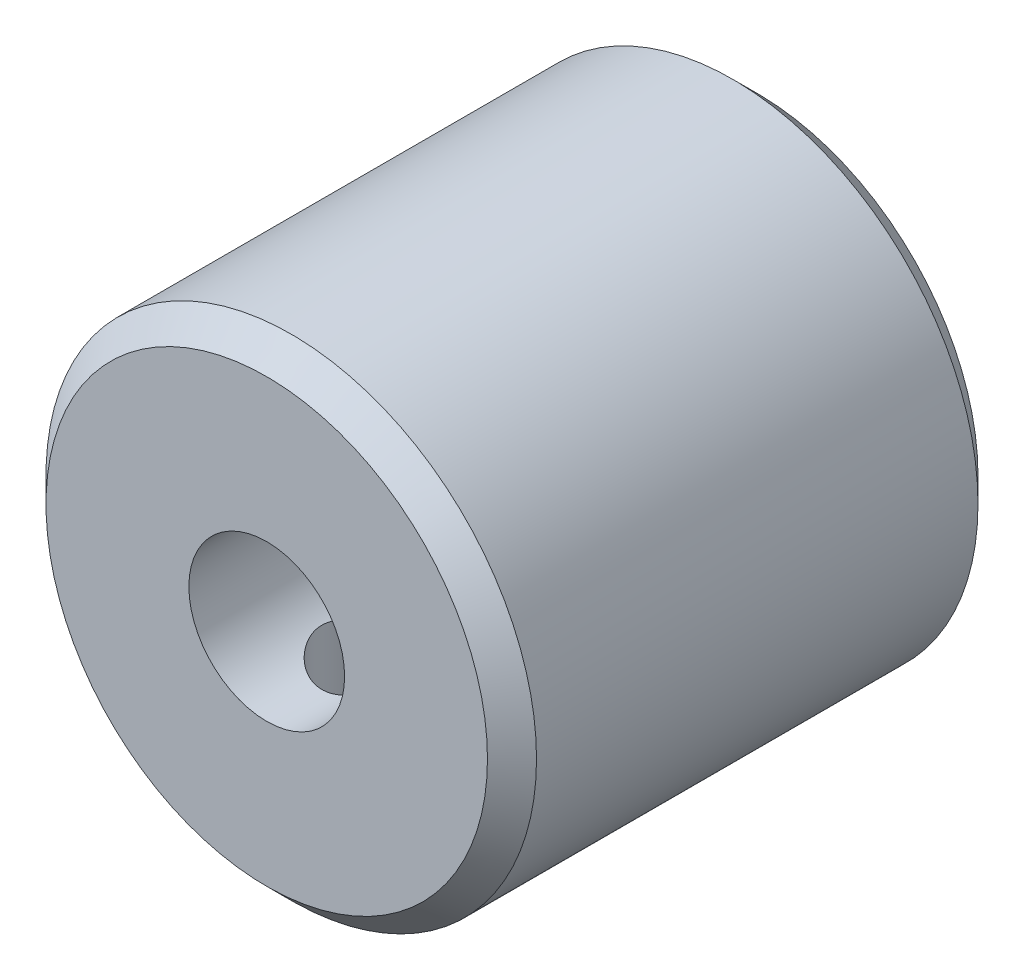
ISO-10303-21;
HEADER;
FILE_DESCRIPTION(('STEP AP214'),'2;1');
FILE_NAME('part.step','',(''),(''),'','','');
FILE_SCHEMA(('AUTOMOTIVE_DESIGN { 1 0 10303 214 1 1 1 1 }'));
ENDSEC;
DATA;
#1=APPLICATION_CONTEXT('core data for automotive mechanical design processes');
#2=APPLICATION_PROTOCOL_DEFINITION('international standard','automotive_design',2000,#1);
#3=PRODUCT_CONTEXT('',#1,'mechanical');
#4=PRODUCT('Part','Part','',(#3));
#5=PRODUCT_RELATED_PRODUCT_CATEGORY('part','',(#4));
#6=PRODUCT_DEFINITION_FORMATION('','',#4);
#7=PRODUCT_DEFINITION_CONTEXT('part definition',#1,'design');
#8=PRODUCT_DEFINITION('design','',#6,#7);
#9=PRODUCT_DEFINITION_SHAPE('','',#8);
#10=(LENGTH_UNIT() NAMED_UNIT(*) SI_UNIT(.MILLI.,.METRE.));
#11=(NAMED_UNIT(*) PLANE_ANGLE_UNIT() SI_UNIT($,.RADIAN.));
#12=(NAMED_UNIT(*) SI_UNIT($,.STERADIAN.) SOLID_ANGLE_UNIT());
#13=UNCERTAINTY_MEASURE_WITH_UNIT(LENGTH_MEASURE(1.E-05),#10,'distance_accuracy_value','');
#14=(GEOMETRIC_REPRESENTATION_CONTEXT(3) GLOBAL_UNCERTAINTY_ASSIGNED_CONTEXT((#13)) GLOBAL_UNIT_ASSIGNED_CONTEXT((#10,
#11,#12)) REPRESENTATION_CONTEXT('',''));
#15=CARTESIAN_POINT('',(0.,0.,0.));
#16=DIRECTION('',(0.,0.,1.));
#17=DIRECTION('',(1.,0.,0.));
#18=AXIS2_PLACEMENT_3D('',#15,#16,#17);
#19=CARTESIAN_POINT('',(0.,0.,5.));
#20=DIRECTION('',(0.,0.,-1.));
#21=DIRECTION('',(-1.,0.,0.));
#22=AXIS2_PLACEMENT_3D('',#19,#20,#21);
#23=CYLINDRICAL_SURFACE('',#22,1.5875);
#24=CARTESIAN_POINT('',(0.,-1.5875,2.125));
#25=CARTESIAN_POINT('',(-0.0454171672703915,-1.58749743073269,2.12500284288988));
#26=CARTESIAN_POINT('',(-0.0908705645486175,-1.58553118946856,2.12855649012872));
#27=CARTESIAN_POINT('',(-0.180397474742064,-1.57785918643117,2.14259601348306));
#28=CARTESIAN_POINT('',(-0.224469037782208,-1.57214836947093,2.15309126094395));
#29=CARTESIAN_POINT('',(-0.309808743333079,-1.55757562422254,2.18046123539258));
#30=CARTESIAN_POINT('',(-0.351087633505968,-1.5487267042626,2.19730964470073));
#31=CARTESIAN_POINT('',(-0.430149329626289,-1.5286575434006,2.23675012411678));
#32=CARTESIAN_POINT('',(-0.467931977044709,-1.51743719504729,2.25934245449556));
#33=CARTESIAN_POINT('',(-0.54185906580046,-1.49270462707936,2.31138108884109));
#34=CARTESIAN_POINT('',(-0.577710731935367,-1.47908770407883,2.34119267625411));
#35=CARTESIAN_POINT('',(-0.64418267175549,-1.45137326900455,2.40601982591914));
#36=CARTESIAN_POINT('',(-0.674798032873614,-1.43727532035425,2.44104021798518));
#37=CARTESIAN_POINT('',(-0.732992485731451,-1.40855673758792,2.51941807126515));
#38=CARTESIAN_POINT('',(-0.759970470973205,-1.39402264499961,2.56325773747891));
#39=CARTESIAN_POINT('',(-0.806067190483714,-1.36788811317943,2.65570061755626));
#40=CARTESIAN_POINT('',(-0.825192141404631,-1.35628535624174,2.70430002559675));
#41=CARTESIAN_POINT('',(-0.853679413441935,-1.33852742371106,2.8018359305105));
#42=CARTESIAN_POINT('',(-0.863582253594607,-1.3320743536933,2.85055708463884));
#43=CARTESIAN_POINT('',(-0.874941794813468,-1.32464526189731,2.94935754242108));
#44=CARTESIAN_POINT('',(-0.876410716322343,-1.32366131562288,2.99943477532631));
#45=CARTESIAN_POINT('',(-0.871254765726646,-1.32705423910451,3.09123604953529));
#46=CARTESIAN_POINT('',(-0.865834198499974,-1.33063371187153,3.13306556067878));
#47=CARTESIAN_POINT('',(-0.849184818616249,-1.34131965108467,3.21508637655361));
#48=CARTESIAN_POINT('',(-0.837953336505919,-1.3484277384663,3.25527691920346));
#49=CARTESIAN_POINT('',(-0.809855349167469,-1.36549037960906,3.33398313485091));
#50=CARTESIAN_POINT('',(-0.792872989921156,-1.37550279380309,3.37244429087748));
#51=CARTESIAN_POINT('',(-0.753855973097453,-1.39726739410924,3.4461700972764));
#52=CARTESIAN_POINT('',(-0.731819140109118,-1.40902032855538,3.48143336215308));
#53=CARTESIAN_POINT('',(-0.679262218129388,-1.43518298795478,3.55364748201827));
#54=CARTESIAN_POINT('',(-0.647951034206348,-1.44971847274687,3.58997920601274));
#55=CARTESIAN_POINT('',(-0.57970126454564,-1.47833460694525,3.65716546685922));
#56=CARTESIAN_POINT('',(-0.542758830744465,-1.49241493729002,3.68801622688717));
#57=CARTESIAN_POINT('',(-0.461184255174894,-1.5196824748554,3.74537436896565));
#58=CARTESIAN_POINT('',(-0.416201036542465,-1.53274488985838,3.77144693475787));
#59=CARTESIAN_POINT('',(-0.321593896994065,-1.55534248764104,3.8154237746184));
#60=CARTESIAN_POINT('',(-0.271974408026113,-1.56488099666917,3.83333575528515));
#61=CARTESIAN_POINT('',(-0.174454043982302,-1.57858041330335,3.85877118487706));
#62=CARTESIAN_POINT('',(-0.126825208538458,-1.58316023600003,3.8671083861097));
#63=CARTESIAN_POINT('',(-0.0306371038385625,-1.5879327344506,3.87579311005673));
#64=CARTESIAN_POINT('',(0.017921546474652,-1.58812823358383,3.87614577458645));
#65=CARTESIAN_POINT('',(0.109486774797948,-1.58431772411544,3.86921632551847));
#66=CARTESIAN_POINT('',(0.152570140497963,-1.5807225886303,3.86268085578954));
#67=CARTESIAN_POINT('',(0.236916324634259,-1.57029713420082,3.84342590921152));
#68=CARTESIAN_POINT('',(0.278178958838685,-1.56346648868624,3.83070580812461));
#69=CARTESIAN_POINT('',(0.358816906525529,-1.54697755791703,3.79924426395291));
#70=CARTESIAN_POINT('',(0.398129714048013,-1.53725968134985,3.7803750180397));
#71=CARTESIAN_POINT('',(0.473132853294014,-1.51585783039415,3.73732111104386));
#72=CARTESIAN_POINT('',(0.508821861005728,-1.50417314151457,3.71313451732811));
#73=CARTESIAN_POINT('',(0.579832517608267,-1.47835474893972,3.65703146092703));
#74=CARTESIAN_POINT('',(0.614663386689606,-1.46409336823534,3.62455211146354));
#75=CARTESIAN_POINT('',(0.678648445504201,-1.43555652687459,3.55436455655753));
#76=CARTESIAN_POINT('',(0.70779667147375,-1.42128106706096,3.5166509281759));
#77=CARTESIAN_POINT('',(0.761834431307986,-1.39311312913222,3.43345342164588));
#78=CARTESIAN_POINT('',(0.786210517822469,-1.37933854188116,3.38759208000716));
#79=CARTESIAN_POINT('',(0.826667739297664,-1.35548297144746,3.29146885438906));
#80=CARTESIAN_POINT('',(0.842760965431796,-1.34539661052494,3.24121351088275));
#81=CARTESIAN_POINT('',(0.864585341315519,-1.33146623546188,3.14283750191008));
#82=CARTESIAN_POINT('',(0.871168938844523,-1.32711235764623,3.09498130989524));
#83=CARTESIAN_POINT('',(0.876323519136846,-1.32371677747805,2.9986675986912));
#84=CARTESIAN_POINT('',(0.874901493422308,-1.32467043990219,2.95021064106392));
#85=CARTESIAN_POINT('',(0.864916166051227,-1.331202719063,2.86117281001033));
#86=CARTESIAN_POINT('',(0.857359153657994,-1.33612901032972,2.82042329549937));
#87=CARTESIAN_POINT('',(0.83675736948217,-1.34912595061852,2.74086357887791));
#88=CARTESIAN_POINT('',(0.823710325134274,-1.35719790166497,2.70205418732108));
#89=CARTESIAN_POINT('',(0.791650172225481,-1.37615835705143,2.62480633283136));
#90=CARTESIAN_POINT('',(0.772321799905801,-1.3871885859529,2.58653476847737));
#91=CARTESIAN_POINT('',(0.728545161387628,-1.41067191172468,2.51352169633025));
#92=CARTESIAN_POINT('',(0.704094183454616,-1.42312576061842,2.47878207275243));
#93=CARTESIAN_POINT('',(0.64627549817979,-1.45039961574333,2.40809343117753));
#94=CARTESIAN_POINT('',(0.612109646378666,-1.46528297562292,2.37281808439262));
#95=CARTESIAN_POINT('',(0.538093774881354,-1.4940509185377,2.30826869263461));
#96=CARTESIAN_POINT('',(0.498239678492876,-1.50793477441159,2.278998988822));
#97=CARTESIAN_POINT('',(0.41207674031173,-1.53376728428567,2.22640171104107));
#98=CARTESIAN_POINT('',(0.365588650470946,-1.54562947463329,2.20332270248029));
#99=CARTESIAN_POINT('',(0.26857768740612,-1.56539256755205,2.1656245313491));
#100=CARTESIAN_POINT('',(0.218065508981272,-1.57330358903599,2.15098374358358));
#101=CARTESIAN_POINT('',(0.139136449938288,-1.58163165250096,2.1356826922273));
#102=CARTESIAN_POINT('',(0.111512220231608,-1.58382335938445,2.13168557509789));
#103=CARTESIAN_POINT('',(0.0559299041083315,-1.58675831202277,2.12634337605553));
#104=CARTESIAN_POINT('',(0.0279718233698305,-1.58750158237723,2.1249982491023));
#105=CARTESIAN_POINT('',(0.,-1.5875,2.125));
#106=B_SPLINE_CURVE_WITH_KNOTS('',3,(#24,#25,#26,#27,#28,#29,#30,#31,#32,#33,#34,#35,#36,#37,
#38,#39,#40,#41,#42,#43,#44,#45,#46,#47,#48,#49,#50,#51,#52,#53,#54,#55,#56,#57,#58,#59,#60,#61,
#62,#63,#64,#65,#66,#67,#68,#69,#70,#71,#72,#73,#74,#75,#76,#77,#78,#79,#80,#81,#82,#83,#84,#85,
#86,#87,#88,#89,#90,#91,#92,#93,#94,#95,#96,#97,#98,#99,#100,#101,#102,#103,#104,#105),
.UNSPECIFIED.,.T.,.F.,(4,2,2,2,2,2,2,2,2,2,2,2,2,2,2,2,2,2,2,2,2,2,2,2,2,2,2,2,2,2,2,2,2,2,2,2,
2,2,2,2,4),(0.,0.136138910180349,0.272461987693227,0.408226448668004,0.54399706255384,
0.689132991238192,0.834404344603793,0.994064820621523,1.15359866073264,1.30305190647804,
1.45228854512576,1.57868533175798,1.70514023493623,1.83431128683925,1.96353803774841,
2.1132570493831,2.26307883262492,2.42303249795653,2.58283479339052,2.7277179144785,
2.87250773228733,3.00307326700455,3.13365198292278,3.26713907256983,3.40067475962752,
3.54919759723243,3.69787547581227,3.85821651177356,4.01832281607177,4.16292649542564,
4.30740390817,4.43206404168932,4.55677582835407,4.68909166707472,4.82147772712209,
4.97474708366707,5.1281268431894,5.28696559077414,5.4453954405586,5.52924299103784,
5.61308911747401),.UNSPECIFIED.);
#107=CARTESIAN_POINT('',(0.,-1.5875,2.125));
#108=VERTEX_POINT('',#107);
#109=EDGE_CURVE('E213',#108,#108,#106,.T.);
#110=ORIENTED_EDGE('',*,*,#109,.F.);
#111=EDGE_LOOP('',(#110));
#112=FACE_BOUND('',#111,.T.);
#113=CARTESIAN_POINT('',(0.,0.,5.));
#114=DIRECTION('',(0.,0.,1.));
#115=DIRECTION('',(1.,0.,0.));
#116=AXIS2_PLACEMENT_3D('',#113,#114,#115);
#117=CIRCLE('',#116,1.5875);
#118=CARTESIAN_POINT('',(1.5875,0.,5.));
#119=VERTEX_POINT('',#118);
#120=EDGE_CURVE('E70',#119,#119,#117,.T.);
#121=ORIENTED_EDGE('',*,*,#120,.T.);
#122=EDGE_LOOP('',(#121));
#123=FACE_BOUND('',#122,.T.);
#124=CARTESIAN_POINT('',(0.,0.,0.));
#125=DIRECTION('',(0.,0.,-1.));
#126=DIRECTION('',(-1.,0.,0.));
#127=AXIS2_PLACEMENT_3D('',#124,#125,#126);
#128=CIRCLE('',#127,1.5875);
#129=CARTESIAN_POINT('',(-1.5875,0.,0.));
#130=VERTEX_POINT('',#129);
#131=EDGE_CURVE('E71',#130,#130,#128,.T.);
#132=ORIENTED_EDGE('',*,*,#131,.T.);
#133=EDGE_LOOP('',(#132));
#134=FACE_BOUND('',#133,.T.);
#135=ADVANCED_FACE('F45',(#112,#123,#134),#23,.F.);
#136=CARTESIAN_POINT('',(0.,0.,5.));
#137=DIRECTION('',(0.,0.,1.));
#138=DIRECTION('',(1.,0.,0.));
#139=AXIS2_PLACEMENT_3D('',#136,#137,#138);
#140=PLANE('',#139);
#141=CARTESIAN_POINT('',(0.,0.,5.));
#142=DIRECTION('',(0.,0.,1.));
#143=DIRECTION('',(1.,0.,0.));
#144=AXIS2_PLACEMENT_3D('',#141,#142,#143);
#145=CIRCLE('',#144,4.5);
#146=CARTESIAN_POINT('',(4.5,0.,5.));
#147=VERTEX_POINT('',#146);
#148=EDGE_CURVE('E10',#147,#147,#145,.T.);
#149=ORIENTED_EDGE('',*,*,#148,.T.);
#150=EDGE_LOOP('',(#149));
#151=FACE_BOUND('',#150,.T.);
#152=ORIENTED_EDGE('',*,*,#120,.F.);
#153=EDGE_LOOP('',(#152));
#154=FACE_BOUND('',#153,.T.);
#155=ADVANCED_FACE('F126',(#151,#154),#140,.T.);
#156=CARTESIAN_POINT('',(0.,0.,-5.));
#157=DIRECTION('',(0.,0.,1.));
#158=DIRECTION('',(1.,0.,0.));
#159=AXIS2_PLACEMENT_3D('',#156,#157,#158);
#160=PLANE('',#159);
#161=CARTESIAN_POINT('',(0.,0.,-5.));
#162=DIRECTION('',(0.,0.,1.));
#163=DIRECTION('',(1.,0.,0.));
#164=AXIS2_PLACEMENT_3D('',#161,#162,#163);
#165=CIRCLE('',#164,4.5);
#166=CARTESIAN_POINT('',(4.5,0.,-5.));
#167=VERTEX_POINT('',#166);
#168=EDGE_CURVE('E54',#167,#167,#165,.F.);
#169=ORIENTED_EDGE('',*,*,#168,.T.);
#170=EDGE_LOOP('',(#169));
#171=FACE_BOUND('',#170,.T.);
#172=CARTESIAN_POINT('',(0.,0.,-5.));
#173=DIRECTION('',(0.,0.,-1.));
#174=DIRECTION('',(-1.,0.,0.));
#175=AXIS2_PLACEMENT_3D('',#172,#173,#174);
#176=CIRCLE('',#175,3.1);
#177=CARTESIAN_POINT('',(-3.1,0.,-5.));
#178=VERTEX_POINT('',#177);
#179=EDGE_CURVE('E79',#178,#178,#176,.T.);
#180=ORIENTED_EDGE('',*,*,#179,.F.);
#181=EDGE_LOOP('',(#180));
#182=FACE_BOUND('',#181,.T.);
#183=ADVANCED_FACE('F129',(#171,#182),#160,.F.);
#184=CARTESIAN_POINT('',(0.,0.,5.));
#185=DIRECTION('',(0.,0.,-1.));
#186=DIRECTION('',(-1.,0.,0.));
#187=AXIS2_PLACEMENT_3D('',#184,#185,#186);
#188=CYLINDRICAL_SURFACE('',#187,5.);
#189=CARTESIAN_POINT('',(0.,-5.,2.125));
#190=CARTESIAN_POINT('',(-0.0487501094989268,-4.99999914275497,2.12500192117746));
#191=CARTESIAN_POINT('',(-0.0975259127429578,-4.99927962652907,2.12908789063088));
#192=CARTESIAN_POINT('',(-0.193707009431263,-4.99647864363298,2.14531557747874));
#193=CARTESIAN_POINT('',(-0.241111043359642,-4.99439596434472,2.15746446747556));
#194=CARTESIAN_POINT('',(-0.333143358053326,-4.9891020139581,2.18943786899752));
#195=CARTESIAN_POINT('',(-0.377773963819231,-4.98589170360864,2.20925584786707));
#196=CARTESIAN_POINT('',(-0.463071487684834,-4.97869453598125,2.25598719203051));
#197=CARTESIAN_POINT('',(-0.503738806960561,-4.97470775742257,2.28289983815651));
#198=CARTESIAN_POINT('',(-0.580387290324578,-4.96635208436405,2.34335680488982));
#199=CARTESIAN_POINT('',(-0.616320824905511,-4.96197995101908,2.37696106982108));
#200=CARTESIAN_POINT('',(-0.682070048249341,-4.95337083160601,2.44971836846761));
#201=CARTESIAN_POINT('',(-0.711885330946749,-4.94913385452393,2.48887177018508));
#202=CARTESIAN_POINT('',(-0.764745399597419,-4.94124337561985,2.57194678136325));
#203=CARTESIAN_POINT('',(-0.78774256012236,-4.93759405587701,2.6158991265517));
#204=CARTESIAN_POINT('',(-0.826008900852615,-4.93133730599557,2.7071176962039));
#205=CARTESIAN_POINT('',(-0.841278658327646,-4.92872979803227,2.75438367282492));
#206=CARTESIAN_POINT('',(-0.863505580295149,-4.92488429460338,2.85038101572072));
#207=CARTESIAN_POINT('',(-0.870545305999552,-4.92363270645214,2.89909271104713));
#208=CARTESIAN_POINT('',(-0.876368425046627,-4.92259969093138,2.99702073380921));
#209=CARTESIAN_POINT('',(-0.875152462644541,-4.92281814884277,3.04623702156835));
#210=CARTESIAN_POINT('',(-0.864565853569317,-4.92468814513331,3.14318442521639));
#211=CARTESIAN_POINT('',(-0.855288388211477,-4.92632330747898,3.19092607857035));
#212=CARTESIAN_POINT('',(-0.828988558074648,-4.93081680373849,3.28416461617108));
#213=CARTESIAN_POINT('',(-0.811965902962413,-4.93367518350516,3.32966141619726));
#214=CARTESIAN_POINT('',(-0.770565730550925,-4.94031051718111,3.41739527225432));
#215=CARTESIAN_POINT('',(-0.746149933714665,-4.9440922316226,3.45961388993045));
#216=CARTESIAN_POINT('',(-0.690683688967044,-4.95214488870596,3.53939018454047));
#217=CARTESIAN_POINT('',(-0.659632652087572,-4.95641587476174,3.57694744724737));
#218=CARTESIAN_POINT('',(-0.59127170188294,-4.96503756922751,3.64687391724938));
#219=CARTESIAN_POINT('',(-0.553881934056068,-4.96938856865413,3.6791650727837));
#220=CARTESIAN_POINT('',(-0.474173840588685,-4.97762612546346,3.7370274721127));
#221=CARTESIAN_POINT('',(-0.431855476858921,-4.98151267925636,3.76259866396908));
#222=CARTESIAN_POINT('',(-0.343414968258774,-4.98838981445336,3.80630405407797));
#223=CARTESIAN_POINT('',(-0.297289109487091,-4.99137950755354,3.824430885508));
#224=CARTESIAN_POINT('',(-0.202583498061396,-4.99611904699053,3.85265807346813));
#225=CARTESIAN_POINT('',(-0.154003972458799,-4.99786900782229,3.86275917122197));
#226=CARTESIAN_POINT('',(-0.0564422773455108,-4.99991638609343,3.87454125761278));
#227=CARTESIAN_POINT('',(-0.0074734123891832,-5.00023227249724,3.87632931440065));
#228=CARTESIAN_POINT('',(0.0900639248266533,-4.99942666204999,3.87172068696385));
#229=CARTESIAN_POINT('',(0.138632414041912,-4.99830522638694,3.86532435115569));
#230=CARTESIAN_POINT('',(0.233656166890118,-4.99476243536818,3.84461755286773));
#231=CARTESIAN_POINT('',(0.280123435956158,-4.99234986416349,3.83036055029467));
#232=CARTESIAN_POINT('',(0.370008247372695,-4.98649419689881,3.79439444489028));
#233=CARTESIAN_POINT('',(0.413425603991588,-4.98305103814581,3.77268488869125));
#234=CARTESIAN_POINT('',(0.496440071029972,-4.97547017014808,3.72218790596204));
#235=CARTESIAN_POINT('',(0.535996245786059,-4.97132607546551,3.69333416081651));
#236=CARTESIAN_POINT('',(0.60974350508432,-4.96282111614282,3.62945849993344));
#237=CARTESIAN_POINT('',(0.643934156866018,-4.95846023405486,3.59443608714016));
#238=CARTESIAN_POINT('',(0.706380574970102,-4.949952873694,3.51873525246942));
#239=CARTESIAN_POINT('',(0.734563712125386,-4.94580943106317,3.4779965219531));
#240=CARTESIAN_POINT('',(0.783686536205751,-4.93826443479044,3.39230008464813));
#241=CARTESIAN_POINT('',(0.804626469135323,-4.93486285595371,3.34734252121172));
#242=CARTESIAN_POINT('',(0.838562018663509,-4.92920991248829,3.2546804386031));
#243=CARTESIAN_POINT('',(0.851592677626465,-4.92695348163441,3.20698907618682));
#244=CARTESIAN_POINT('',(0.869449267335573,-4.92383403155312,3.1100513372954));
#245=CARTESIAN_POINT('',(0.874275992307767,-4.92297087744246,3.06080511181738));
#246=CARTESIAN_POINT('',(0.875563826482354,-4.92274192651214,2.96288164693503));
#247=CARTESIAN_POINT('',(0.872139343490512,-4.92335565174978,2.91420592261074));
#248=CARTESIAN_POINT('',(0.85727055160933,-4.92596622439218,2.81813493831118));
#249=CARTESIAN_POINT('',(0.8458262766949,-4.92796306593754,2.77073967291227));
#250=CARTESIAN_POINT('',(0.81528833797368,-4.9331067666413,2.6786259286533));
#251=CARTESIAN_POINT('',(0.796205510132455,-4.93625199615651,2.63390376062232));
#252=CARTESIAN_POINT('',(0.750944178717729,-4.94333948543074,2.54827728610193));
#253=CARTESIAN_POINT('',(0.724765264633723,-4.94728179129748,2.50737320067372));
#254=CARTESIAN_POINT('',(0.665650633739469,-4.95558363821485,2.42996785637861));
#255=CARTESIAN_POINT('',(0.632631087648904,-4.95994795856167,2.39353112077113));
#256=CARTESIAN_POINT('',(0.560948607936387,-4.96856489629516,2.32667689990941));
#257=CARTESIAN_POINT('',(0.522284376947037,-4.97281748773634,2.29626080222751));
#258=CARTESIAN_POINT('',(0.440055093696432,-4.98076994692184,2.24209529667808));
#259=CARTESIAN_POINT('',(0.396454612747407,-4.98446530874485,2.21839900044762));
#260=CARTESIAN_POINT('',(0.305843313146272,-4.99084308949771,2.17870436206513));
#261=CARTESIAN_POINT('',(0.25883586852507,-4.99352649469304,2.16269852050771));
#262=CARTESIAN_POINT('',(0.176385235003814,-4.99700720137926,2.14222720968014));
#263=CARTESIAN_POINT('',(0.141434689052827,-4.99812337235796,2.13577761652577));
#264=CARTESIAN_POINT('',(0.0709939640711841,-4.99962007640936,2.12716335530781));
#265=CARTESIAN_POINT('',(0.0355037959363215,-5.00000062431558,2.12499860084227));
#266=CARTESIAN_POINT('',(0.,-5.,2.125));
#267=B_SPLINE_CURVE_WITH_KNOTS('',3,(#189,#190,#191,#192,#193,#194,#195,#196,#197,#198,#199,
#200,#201,#202,#203,#204,#205,#206,#207,#208,#209,#210,#211,#212,#213,#214,#215,#216,#217,#218,
#219,#220,#221,#222,#223,#224,#225,#226,#227,#228,#229,#230,#231,#232,#233,#234,#235,#236,#237,
#238,#239,#240,#241,#242,#243,#244,#245,#246,#247,#248,#249,#250,#251,#252,#253,#254,#255,#256,
#257,#258,#259,#260,#261,#262,#263,#264,#265,#266),.UNSPECIFIED.,.T.,.F.,(4,2,2,2,2,2,2,2,2,2,2,
2,2,2,2,2,2,2,2,2,2,2,2,2,2,2,2,2,2,2,2,2,2,2,2,2,2,2,4),(0.,0.146120527958717,
0.292371216169887,0.438497598902477,0.584609174877282,0.732093831995112,0.879588274436341,
1.02808994128371,1.17658051278969,1.32356832976731,1.47054467627976,1.6158444167037,
1.76114960422741,1.90722039176816,2.0533041504747,2.2013875243299,2.34947204268134,
2.49770275207966,2.64591976990815,2.79222243276497,2.93851886760092,3.08383240751077,
3.22915478897325,3.37588037852157,3.5226177962621,3.6710395560945,3.81945627451096,
3.96721053316049,4.11495048684783,4.26065375560349,4.40635640710802,4.55185309484786,
4.69735820140737,4.84476481719984,4.99220536624045,5.14078068583639,5.2892108255384,
5.39562982795109,5.50204668444796),.UNSPECIFIED.);
#268=CARTESIAN_POINT('',(0.,-5.,2.125));
#269=VERTEX_POINT('',#268);
#270=EDGE_CURVE('E143',#269,#269,#267,.T.);
#271=ORIENTED_EDGE('',*,*,#270,.T.);
#272=EDGE_LOOP('',(#271));
#273=FACE_BOUND('',#272,.T.);
#274=CARTESIAN_POINT('',(0.,-5.,-3.875));
#275=CARTESIAN_POINT('',(-0.0487501094989268,-4.99999914275497,-3.87499807882254));
#276=CARTESIAN_POINT('',(-0.0975259127429578,-4.99927962652907,-3.87091210936912));
#277=CARTESIAN_POINT('',(-0.193707009431263,-4.99647864363298,-3.85468442252126));
#278=CARTESIAN_POINT('',(-0.241111043359642,-4.99439596434472,-3.84253553252444));
#279=CARTESIAN_POINT('',(-0.333143358053326,-4.9891020139581,-3.81056213100248));
#280=CARTESIAN_POINT('',(-0.377773963819231,-4.98589170360864,-3.79074415213293));
#281=CARTESIAN_POINT('',(-0.463071487684834,-4.97869453598125,-3.74401280796949));
#282=CARTESIAN_POINT('',(-0.503738806960561,-4.97470775742257,-3.71710016184349));
#283=CARTESIAN_POINT('',(-0.580387290324578,-4.96635208436405,-3.65664319511018));
#284=CARTESIAN_POINT('',(-0.616320824905511,-4.96197995101908,-3.62303893017892));
#285=CARTESIAN_POINT('',(-0.682070048249341,-4.95337083160601,-3.5502816315324));
#286=CARTESIAN_POINT('',(-0.711885330946749,-4.94913385452393,-3.51112822981492));
#287=CARTESIAN_POINT('',(-0.764745399597419,-4.94124337561985,-3.42805321863675));
#288=CARTESIAN_POINT('',(-0.787742560122361,-4.93759405587701,-3.3841008734483));
#289=CARTESIAN_POINT('',(-0.826008900852615,-4.93133730599557,-3.2928823037961));
#290=CARTESIAN_POINT('',(-0.841278658327647,-4.92872979803227,-3.24561632717508));
#291=CARTESIAN_POINT('',(-0.86350558029515,-4.92488429460338,-3.14961898427929));
#292=CARTESIAN_POINT('',(-0.870545305999553,-4.92363270645214,-3.10090728895288));
#293=CARTESIAN_POINT('',(-0.876368425046628,-4.92259969093138,-3.00297926619079));
#294=CARTESIAN_POINT('',(-0.875152462644542,-4.92281814884277,-2.95376297843165));
#295=CARTESIAN_POINT('',(-0.864565853569318,-4.92468814513331,-2.85681557478361));
#296=CARTESIAN_POINT('',(-0.855288388211479,-4.92632330747898,-2.80907392142965));
#297=CARTESIAN_POINT('',(-0.82898855807465,-4.93081680373849,-2.71583538382892));
#298=CARTESIAN_POINT('',(-0.811965902962414,-4.93367518350516,-2.67033858380274));
#299=CARTESIAN_POINT('',(-0.770565730550927,-4.94031051718111,-2.58260472774568));
#300=CARTESIAN_POINT('',(-0.746149933714667,-4.9440922316226,-2.54038611006956));
#301=CARTESIAN_POINT('',(-0.690683688967046,-4.95214488870596,-2.46060981545953));
#302=CARTESIAN_POINT('',(-0.659632652087574,-4.95641587476174,-2.42305255275264));
#303=CARTESIAN_POINT('',(-0.591271701882942,-4.96503756922751,-2.35312608275062));
#304=CARTESIAN_POINT('',(-0.55388193405607,-4.96938856865413,-2.3208349272163));
#305=CARTESIAN_POINT('',(-0.474173840588687,-4.97762612546346,-2.2629725278873));
#306=CARTESIAN_POINT('',(-0.431855476858923,-4.98151267925636,-2.23740133603093));
#307=CARTESIAN_POINT('',(-0.343414968258776,-4.98838981445335,-2.19369594592203));
#308=CARTESIAN_POINT('',(-0.297289109487093,-4.99137950755354,-2.17556911449201));
#309=CARTESIAN_POINT('',(-0.202583498061399,-4.99611904699054,-2.14734192653187));
#310=CARTESIAN_POINT('',(-0.154003972458801,-4.99786900782229,-2.13724082877804));
#311=CARTESIAN_POINT('',(-0.0564422773455133,-4.99991638609343,-2.12545874238722));
#312=CARTESIAN_POINT('',(-0.00747341238918567,-5.00023227249724,-2.12367068559935));
#313=CARTESIAN_POINT('',(0.0900639248266509,-4.99942666204999,-2.12827931303615));
#314=CARTESIAN_POINT('',(0.138632414041909,-4.99830522638694,-2.13467564884431));
#315=CARTESIAN_POINT('',(0.233656166890116,-4.99476243536818,-2.15538244713227));
#316=CARTESIAN_POINT('',(0.280123435956156,-4.99234986416349,-2.16963944970533));
#317=CARTESIAN_POINT('',(0.370008247372693,-4.98649419689881,-2.20560555510972));
#318=CARTESIAN_POINT('',(0.413425603991585,-4.98305103814581,-2.22731511130875));
#319=CARTESIAN_POINT('',(0.49644007102997,-4.97547017014808,-2.27781209403796));
#320=CARTESIAN_POINT('',(0.535996245786057,-4.97132607546551,-2.30666583918349));
#321=CARTESIAN_POINT('',(0.609743505084318,-4.96282111614282,-2.37054150006656));
#322=CARTESIAN_POINT('',(0.643934156866016,-4.95846023405486,-2.40556391285984));
#323=CARTESIAN_POINT('',(0.7063805749701,-4.949952873694,-2.48126474753057));
#324=CARTESIAN_POINT('',(0.734563712125384,-4.94580943106317,-2.52200347804689));
#325=CARTESIAN_POINT('',(0.783686536205749,-4.93826443479044,-2.60769991535186));
#326=CARTESIAN_POINT('',(0.804626469135321,-4.93486285595371,-2.65265747878828));
#327=CARTESIAN_POINT('',(0.838562018663507,-4.92920991248829,-2.7453195613969));
#328=CARTESIAN_POINT('',(0.851592677626464,-4.92695348163441,-2.79301092381318));
#329=CARTESIAN_POINT('',(0.869449267335572,-4.92383403155312,-2.8899486627046));
#330=CARTESIAN_POINT('',(0.874275992307766,-4.92297087744246,-2.93919488818262));
#331=CARTESIAN_POINT('',(0.875563826482353,-4.92274192651214,-3.03711835306497));
#332=CARTESIAN_POINT('',(0.872139343490511,-4.92335565174978,-3.08579407738926));
#333=CARTESIAN_POINT('',(0.857270551609329,-4.92596622439218,-3.18186506168882));
#334=CARTESIAN_POINT('',(0.8458262766949,-4.92796306593754,-3.22926032708772));
#335=CARTESIAN_POINT('',(0.81528833797368,-4.9331067666413,-3.32137407134669));
#336=CARTESIAN_POINT('',(0.796205510132455,-4.93625199615651,-3.36609623937768));
#337=CARTESIAN_POINT('',(0.750944178717728,-4.94333948543074,-3.45172271389807));
#338=CARTESIAN_POINT('',(0.724765264633723,-4.94728179129748,-3.49262679932628));
#339=CARTESIAN_POINT('',(0.665650633739469,-4.95558363821485,-3.57003214362139));
#340=CARTESIAN_POINT('',(0.632631087648904,-4.95994795856167,-3.60646887922887));
#341=CARTESIAN_POINT('',(0.560948607936388,-4.96856489629516,-3.67332310009059));
#342=CARTESIAN_POINT('',(0.522284376947038,-4.97281748773634,-3.70373919777249));
#343=CARTESIAN_POINT('',(0.440055093696432,-4.98076994692184,-3.75790470332192));
#344=CARTESIAN_POINT('',(0.396454612747407,-4.98446530874485,-3.78160099955238));
#345=CARTESIAN_POINT('',(0.305843313146272,-4.99084308949771,-3.82129563793487));
#346=CARTESIAN_POINT('',(0.25883586852507,-4.99352649469304,-3.83730147949229));
#347=CARTESIAN_POINT('',(0.176385235003813,-4.99700720137926,-3.85777279031986));
#348=CARTESIAN_POINT('',(0.141434689052827,-4.99812337235796,-3.86422238347423));
#349=CARTESIAN_POINT('',(0.0709939640711834,-4.99962007640936,-3.87283664469219));
#350=CARTESIAN_POINT('',(0.0355037959363212,-5.00000062431558,-3.87500139915773));
#351=CARTESIAN_POINT('',(0.,-5.,-3.875));
#352=B_SPLINE_CURVE_WITH_KNOTS('',3,(#274,#275,#276,#277,#278,#279,#280,#281,#282,#283,#284,
#285,#286,#287,#288,#289,#290,#291,#292,#293,#294,#295,#296,#297,#298,#299,#300,#301,#302,#303,
#304,#305,#306,#307,#308,#309,#310,#311,#312,#313,#314,#315,#316,#317,#318,#319,#320,#321,#322,
#323,#324,#325,#326,#327,#328,#329,#330,#331,#332,#333,#334,#335,#336,#337,#338,#339,#340,#341,
#342,#343,#344,#345,#346,#347,#348,#349,#350,#351),.UNSPECIFIED.,.T.,.F.,(4,2,2,2,2,2,2,2,2,2,2,
2,2,2,2,2,2,2,2,2,2,2,2,2,2,2,2,2,2,2,2,2,2,2,2,2,2,2,4),(0.,0.146120527958717,
0.292371216169887,0.438497598902476,0.584609174877282,0.732093831995112,0.879588274436341,
1.02808994128371,1.17658051278969,1.32356832976731,1.47054467627976,1.6158444167037,
1.76114960422741,1.90722039176816,2.0533041504747,2.2013875243299,2.34947204268134,
2.49770275207966,2.64591976990815,2.79222243276497,2.93851886760092,3.08383240751077,
3.22915478897325,3.37588037852157,3.5226177962621,3.6710395560945,3.81945627451096,
3.96721053316049,4.11495048684784,4.26065375560349,4.40635640710802,4.55185309484786,
4.69735820140738,4.84476481719984,4.99220536624045,5.14078068583639,5.2892108255384,
5.39562982795109,5.50204668444796),.UNSPECIFIED.);
#353=CARTESIAN_POINT('',(0.,-5.,-3.875));
#354=VERTEX_POINT('',#353);
#355=EDGE_CURVE('E83',#354,#354,#352,.T.);
#356=ORIENTED_EDGE('',*,*,#355,.T.);
#357=EDGE_LOOP('',(#356));
#358=FACE_BOUND('',#357,.T.);
#359=CARTESIAN_POINT('',(0.,0.,-4.5));
#360=DIRECTION('',(0.,0.,1.));
#361=DIRECTION('',(1.,0.,0.));
#362=AXIS2_PLACEMENT_3D('',#359,#360,#361);
#363=CIRCLE('',#362,5.);
#364=CARTESIAN_POINT('',(5.,0.,-4.5));
#365=VERTEX_POINT('',#364);
#366=EDGE_CURVE('E59',#365,#365,#363,.T.);
#367=ORIENTED_EDGE('',*,*,#366,.T.);
#368=EDGE_LOOP('',(#367));
#369=FACE_BOUND('',#368,.T.);
#370=CARTESIAN_POINT('',(0.,0.,4.49999999999999));
#371=DIRECTION('',(0.,0.,1.));
#372=DIRECTION('',(1.,0.,0.));
#373=AXIS2_PLACEMENT_3D('',#370,#371,#372);
#374=CIRCLE('',#373,5.);
#375=CARTESIAN_POINT('',(5.,0.,4.49999999999999));
#376=VERTEX_POINT('',#375);
#377=EDGE_CURVE('E64',#376,#376,#374,.F.);
#378=ORIENTED_EDGE('',*,*,#377,.T.);
#379=EDGE_LOOP('',(#378));
#380=FACE_BOUND('',#379,.T.);
#381=ADVANCED_FACE('F101',(#273,#358,#369,#380),#188,.T.);
#382=CARTESIAN_POINT('',(0.,0.,0.));
#383=DIRECTION('',(0.,0.,-1.));
#384=DIRECTION('',(-1.,0.,0.));
#385=AXIS2_PLACEMENT_3D('',#382,#383,#384);
#386=CYLINDRICAL_SURFACE('',#385,3.1);
#387=CARTESIAN_POINT('',(0.,-3.1,-3.875));
#388=CARTESIAN_POINT('',(0.048129656562003,-3.09999939543113,-3.87499909291411));
#389=CARTESIAN_POINT('',(0.0962687017153799,-3.0988682405641,-3.87101566531481));
#390=CARTESIAN_POINT('',(0.191153127401612,-3.09446597413923,-3.85521974549603));
#391=CARTESIAN_POINT('',(0.237897946306901,-3.09119401206817,-3.84340414163628));
#392=CARTESIAN_POINT('',(0.328611105259635,-3.08287008657751,-3.81236380650086));
#393=CARTESIAN_POINT('',(0.37258316639466,-3.07782057131015,-3.79314926208779));
#394=CARTESIAN_POINT('',(0.456681108142658,-3.06647115057326,-3.74789608545381));
#395=CARTESIAN_POINT('',(0.496806612351018,-3.06017112291976,-3.72185678632597));
#396=CARTESIAN_POINT('',(0.573104285971677,-3.04681598473589,-3.66298684405411));
#397=CARTESIAN_POINT('',(0.609163484989908,-3.03974677462786,-3.6300129877408));
#398=CARTESIAN_POINT('',(0.675320723793576,-3.02573756863571,-3.55851564781045));
#399=CARTESIAN_POINT('',(0.705417894257936,-3.01879759172849,-3.51999135629906));
#400=CARTESIAN_POINT('',(0.759367194639084,-3.00568620592612,-3.4375604808139));
#401=CARTESIAN_POINT('',(0.783085778068253,-2.99953246838911,-3.39356342179099));
#402=CARTESIAN_POINT('',(0.822743051722537,-2.98889919375759,-3.30200380714667));
#403=CARTESIAN_POINT('',(0.838683370510716,-2.9844193062492,-3.25444200029705));
#404=CARTESIAN_POINT('',(0.861932442155418,-2.9777871543042,-3.15836236043646));
#405=CARTESIAN_POINT('',(0.869447623228127,-2.9755793376432,-3.10989841062103));
#406=CARTESIAN_POINT('',(0.876277164807776,-2.97357564271038,-3.01235119013949));
#407=CARTESIAN_POINT('',(0.875593260007572,-2.97377925424897,-2.963268052671));
#408=CARTESIAN_POINT('',(0.866207129067212,-2.97652591025906,-2.86751695187635));
#409=CARTESIAN_POINT('',(0.857758608967361,-2.97899492916135,-2.82082165128188));
#410=CARTESIAN_POINT('',(0.833491028190452,-2.98587511716421,-2.72953997744733));
#411=CARTESIAN_POINT('',(0.817671315553933,-2.99028645805532,-2.68495379113629));
#412=CARTESIAN_POINT('',(0.778912824477098,-3.00061656991473,-2.5985132810468));
#413=CARTESIAN_POINT('',(0.755888155388455,-3.00655336442796,-2.55669971456433));
#414=CARTESIAN_POINT('',(0.703433139938968,-3.01925623733652,-2.47744245042529));
#415=CARTESIAN_POINT('',(0.674001397820173,-3.02602249628718,-2.43999970767167));
#416=CARTESIAN_POINT('',(0.608287336612944,-3.03992647235147,-2.36910205855245));
#417=CARTESIAN_POINT('',(0.571793072140531,-3.04706870401171,-2.33584418205424));
#418=CARTESIAN_POINT('',(0.493656904397027,-3.06069818311879,-2.27587762266231));
#419=CARTESIAN_POINT('',(0.452014747109644,-3.06718539821593,-2.24916926314044));
#420=CARTESIAN_POINT('',(0.364435789558925,-3.0788221309574,-2.20295846102874));
#421=CARTESIAN_POINT('',(0.318477214049271,-3.08396430959987,-2.18349531666619));
#422=CARTESIAN_POINT('',(0.223761203082302,-3.09227868280362,-2.15263043937843));
#423=CARTESIAN_POINT('',(0.175004458705794,-3.09545136151642,-2.14122672515157));
#424=CARTESIAN_POINT('',(0.0777546461340624,-3.09939450625378,-2.12712221949762));
#425=CARTESIAN_POINT('',(0.0293033048601282,-3.10023877692819,-2.12415394968289));
#426=CARTESIAN_POINT('',(-0.0674062061192652,-3.09964413882876,-2.12626090833447));
#427=CARTESIAN_POINT('',(-0.115664397737756,-3.09820549686411,-2.13133519684865));
#428=CARTESIAN_POINT('',(-0.209638140925678,-3.09325467280128,-2.14916513249973));
#429=CARTESIAN_POINT('',(-0.25538498234507,-3.08978366177961,-2.1617683606853));
#430=CARTESIAN_POINT('',(-0.344108206740186,-3.08116504299582,-2.19411852994159));
#431=CARTESIAN_POINT('',(-0.387084272045926,-3.07601724339761,-2.21386628842407));
#432=CARTESIAN_POINT('',(-0.470060414985566,-3.06444722063334,-2.26041945330171));
#433=CARTESIAN_POINT('',(-0.509977703439005,-3.05800020908567,-2.28736610254271));
#434=CARTESIAN_POINT('',(-0.58481659498077,-3.04457510347664,-2.34737734845901));
#435=CARTESIAN_POINT('',(-0.619737086219398,-3.03759689174415,-2.38044330301398));
#436=CARTESIAN_POINT('',(-0.684741814370833,-3.02361882853666,-2.45300747222972));
#437=CARTESIAN_POINT('',(-0.714636487223761,-3.01662537299412,-2.49267707598555));
#438=CARTESIAN_POINT('',(-0.76735288864657,-3.00364932924821,-2.57662023795228));
#439=CARTESIAN_POINT('',(-0.790174874691303,-2.99766670425005,-2.62089362848804));
#440=CARTESIAN_POINT('',(-0.827930045660988,-2.98745956431163,-2.71259564436091));
#441=CARTESIAN_POINT('',(-0.842905965951055,-2.98322555247058,-2.76000555883639));
#442=CARTESIAN_POINT('',(-0.864627926173548,-2.97700330377196,-2.85681301130171));
#443=CARTESIAN_POINT('',(-0.871376385285094,-2.97501440678001,-2.90620996061443));
#444=CARTESIAN_POINT('',(-0.876300799907127,-2.97356731632428,-3.00363600048035));
#445=CARTESIAN_POINT('',(-0.874783308010382,-2.97401862042984,-3.05164847011314));
#446=CARTESIAN_POINT('',(-0.863939380745828,-2.97718658709252,-3.14670326700767));
#447=CARTESIAN_POINT('',(-0.854613194333485,-2.97990317742816,-3.19374562514936));
#448=CARTESIAN_POINT('',(-0.828603866273421,-2.98723854947334,-3.28508683411633));
#449=CARTESIAN_POINT('',(-0.811993045172931,-2.99183860342456,-3.3294078903138));
#450=CARTESIAN_POINT('',(-0.771941892207556,-3.0024211603279,-3.41466879556958));
#451=CARTESIAN_POINT('',(-0.748500376126433,-3.0084039029552,-3.45560805675577));
#452=CARTESIAN_POINT('',(-0.694555317223817,-3.02132170608498,-3.53438821338747));
#453=CARTESIAN_POINT('',(-0.663846146105261,-3.02828148632351,-3.57208426086782));
#454=CARTESIAN_POINT('',(-0.596619007300127,-3.04223971008472,-3.64188756637916));
#455=CARTESIAN_POINT('',(-0.560099589044118,-3.04923816283999,-3.67399342457647));
#456=CARTESIAN_POINT('',(-0.481194809856757,-3.06269335086754,-3.73249418844149));
#457=CARTESIAN_POINT('',(-0.438686277784366,-3.06913231285133,-3.75872743375556));
#458=CARTESIAN_POINT('',(-0.349680733330394,-3.08054064297866,-3.80363534702423));
#459=CARTESIAN_POINT('',(-0.30318599053906,-3.08551084030344,-3.82231428191797));
#460=CARTESIAN_POINT('',(-0.21413673566009,-3.09287244101727,-3.84948836226694));
#461=CARTESIAN_POINT('',(-0.171920800293122,-3.09552464100289,-3.85903138070588));
#462=CARTESIAN_POINT('',(-0.0864723495679302,-3.0990885818172,-3.87178720604352));
#463=CARTESIAN_POINT('',(-0.0432399637050313,-3.10000054314819,-3.87500081493125));
#464=CARTESIAN_POINT('',(0.,-3.1,-3.875));
#465=B_SPLINE_CURVE_WITH_KNOTS('',3,(#387,#388,#389,#390,#391,#392,#393,#394,#395,#396,#397,
#398,#399,#400,#401,#402,#403,#404,#405,#406,#407,#408,#409,#410,#411,#412,#413,#414,#415,#416,
#417,#418,#419,#420,#421,#422,#423,#424,#425,#426,#427,#428,#429,#430,#431,#432,#433,#434,#435,
#436,#437,#438,#439,#440,#441,#442,#443,#444,#445,#446,#447,#448,#449,#450,#451,#452,#453,#454,
#455,#456,#457,#458,#459,#460,#461,#462,#463,#464),.UNSPECIFIED.,.T.,.F.,(4,2,2,2,2,2,2,2,2,2,2,
2,2,2,2,2,2,2,2,2,2,2,2,2,2,2,2,2,2,2,2,2,2,2,2,2,2,2,4),(0.,0.144230281660122,
0.288517898846881,0.432607567028471,0.576711320734295,0.724149750389295,0.871609662186304,
1.02195147607878,1.17226179884767,1.31880281649581,1.46531283078901,1.60719959556058,
1.74909891216588,1.8927587648375,2.03644994466824,2.18541981628078,2.3343970415604,
2.48417093927111,2.63390800427975,2.77884104425108,2.92375714681676,3.06583445721155,
3.20792802793489,3.3530453187974,3.4981948500206,3.6479695568609,3.79773881064597,
3.94668360163543,4.09558458675436,4.23900189477791,4.38241463056942,4.52443472975049,
4.66647946517595,4.81316304771468,4.95988330848167,5.11024790284304,5.26052744699802,
5.39012119353279,5.51969851840142),.UNSPECIFIED.);
#466=CARTESIAN_POINT('',(0.,-3.1,-3.875));
#467=VERTEX_POINT('',#466);
#468=EDGE_CURVE('E95',#467,#467,#465,.T.);
#469=ORIENTED_EDGE('',*,*,#468,.T.);
#470=EDGE_LOOP('',(#469));
#471=FACE_BOUND('',#470,.T.);
#472=CARTESIAN_POINT('',(0.,0.,0.));
#473=DIRECTION('',(0.,0.,-1.));
#474=DIRECTION('',(-1.,0.,0.));
#475=AXIS2_PLACEMENT_3D('',#472,#473,#474);
#476=CIRCLE('',#475,3.1);
#477=CARTESIAN_POINT('',(-3.1,0.,0.));
#478=VERTEX_POINT('',#477);
#479=EDGE_CURVE('E75',#478,#478,#476,.T.);
#480=ORIENTED_EDGE('',*,*,#479,.F.);
#481=EDGE_LOOP('',(#480));
#482=FACE_BOUND('',#481,.T.);
#483=ORIENTED_EDGE('',*,*,#179,.T.);
#484=EDGE_LOOP('',(#483));
#485=FACE_BOUND('',#484,.T.);
#486=ADVANCED_FACE('F119',(#471,#482,#485),#386,.F.);
#487=CARTESIAN_POINT('',(0.,0.,0.));
#488=DIRECTION('',(0.,0.,-1.));
#489=DIRECTION('',(-1.,0.,0.));
#490=AXIS2_PLACEMENT_3D('',#487,#488,#489);
#491=PLANE('',#490);
#492=ORIENTED_EDGE('',*,*,#131,.F.);
#493=EDGE_LOOP('',(#492));
#494=FACE_BOUND('',#493,.T.);
#495=ORIENTED_EDGE('',*,*,#479,.T.);
#496=EDGE_LOOP('',(#495));
#497=FACE_BOUND('',#496,.T.);
#498=ADVANCED_FACE('F115',(#494,#497),#491,.T.);
#499=CARTESIAN_POINT('',(0.,0.,-4.5));
#500=DIRECTION('',(0.,0.,1.));
#501=DIRECTION('',(1.,0.,0.));
#502=AXIS2_PLACEMENT_3D('',#499,#500,#501);
#503=CONICAL_SURFACE('',#502,5.,0.78539816339745);
#504=ORIENTED_EDGE('',*,*,#168,.F.);
#505=EDGE_LOOP('',(#504));
#506=FACE_BOUND('',#505,.T.);
#507=ORIENTED_EDGE('',*,*,#366,.F.);
#508=EDGE_LOOP('',(#507));
#509=FACE_BOUND('',#508,.T.);
#510=ADVANCED_FACE('F118',(#506,#509),#503,.T.);
#511=CARTESIAN_POINT('',(0.,0.,5.));
#512=DIRECTION('',(0.,0.,-1.));
#513=DIRECTION('',(-1.,0.,0.));
#514=AXIS2_PLACEMENT_3D('',#511,#512,#513);
#515=CONICAL_SURFACE('',#514,4.5,0.785398163397447);
#516=ORIENTED_EDGE('',*,*,#377,.F.);
#517=EDGE_LOOP('',(#516));
#518=FACE_BOUND('',#517,.T.);
#519=ORIENTED_EDGE('',*,*,#148,.F.);
#520=EDGE_LOOP('',(#519));
#521=FACE_BOUND('',#520,.T.);
#522=ADVANCED_FACE('F48',(#518,#521),#515,.T.);
#523=CARTESIAN_POINT('',(0.,-5.,-3.));
#524=DIRECTION('',(0.,-1.,0.));
#525=DIRECTION('',(0.,0.,-1.));
#526=AXIS2_PLACEMENT_3D('',#523,#524,#525);
#527=CYLINDRICAL_SURFACE('',#526,0.874999999999999);
#528=ORIENTED_EDGE('',*,*,#468,.F.);
#529=EDGE_LOOP('',(#528));
#530=FACE_BOUND('',#529,.T.);
#531=ORIENTED_EDGE('',*,*,#355,.F.);
#532=EDGE_LOOP('',(#531));
#533=FACE_BOUND('',#532,.T.);
#534=ADVANCED_FACE('F104',(#530,#533),#527,.F.);
#535=CARTESIAN_POINT('',(0.,-5.,3.));
#536=DIRECTION('',(0.,-1.,0.));
#537=DIRECTION('',(0.,0.,-1.));
#538=AXIS2_PLACEMENT_3D('',#535,#536,#537);
#539=CYLINDRICAL_SURFACE('',#538,0.874999999999999);
#540=ORIENTED_EDGE('',*,*,#109,.T.);
#541=EDGE_LOOP('',(#540));
#542=FACE_BOUND('',#541,.T.);
#543=ORIENTED_EDGE('',*,*,#270,.F.);
#544=EDGE_LOOP('',(#543));
#545=FACE_BOUND('',#544,.T.);
#546=ADVANCED_FACE('F108',(#542,#545),#539,.F.);
#547=CLOSED_SHELL('',(#135,#155,#183,#381,#486,#498,#510,#522,#534,#546));
#548=MANIFOLD_SOLID_BREP('B2',#547);
#549=ADVANCED_BREP_SHAPE_REPRESENTATION('',(#18,#548),#14);
#550=SHAPE_DEFINITION_REPRESENTATION(#9,#549);
ENDSEC;
END-ISO-10303-21;
